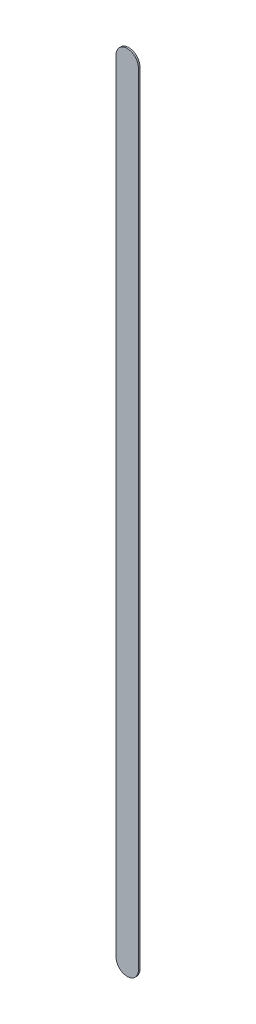
ISO-10303-21;
HEADER;
FILE_DESCRIPTION(('STEP AP214'),'2;1');
FILE_NAME('part.step','',(''),(''),'','','');
FILE_SCHEMA(('AUTOMOTIVE_DESIGN { 1 0 10303 214 1 1 1 1 }'));
ENDSEC;
DATA;
#1=APPLICATION_CONTEXT('core data for automotive mechanical design processes');
#2=APPLICATION_PROTOCOL_DEFINITION('international standard','automotive_design',2000,#1);
#3=PRODUCT_CONTEXT('',#1,'mechanical');
#4=PRODUCT('Part','Part','',(#3));
#5=PRODUCT_RELATED_PRODUCT_CATEGORY('part','',(#4));
#6=PRODUCT_DEFINITION_FORMATION('','',#4);
#7=PRODUCT_DEFINITION_CONTEXT('part definition',#1,'design');
#8=PRODUCT_DEFINITION('design','',#6,#7);
#9=PRODUCT_DEFINITION_SHAPE('','',#8);
#10=(LENGTH_UNIT() NAMED_UNIT(*) SI_UNIT(.MILLI.,.METRE.));
#11=(NAMED_UNIT(*) PLANE_ANGLE_UNIT() SI_UNIT($,.RADIAN.));
#12=(NAMED_UNIT(*) SI_UNIT($,.STERADIAN.) SOLID_ANGLE_UNIT());
#13=UNCERTAINTY_MEASURE_WITH_UNIT(LENGTH_MEASURE(1.E-05),#10,'distance_accuracy_value','');
#14=(GEOMETRIC_REPRESENTATION_CONTEXT(3) GLOBAL_UNCERTAINTY_ASSIGNED_CONTEXT((#13)) GLOBAL_UNIT_ASSIGNED_CONTEXT((#10,
#11,#12)) REPRESENTATION_CONTEXT('',''));
#15=CARTESIAN_POINT('',(0.,0.,0.));
#16=DIRECTION('',(0.,0.,1.));
#17=DIRECTION('',(1.,0.,0.));
#18=AXIS2_PLACEMENT_3D('',#15,#16,#17);
#19=CARTESIAN_POINT('',(62.8193435,82.3306456,0.));
#20=DIRECTION('',(-1.,0.,0.));
#21=DIRECTION('',(0.,1.,0.));
#22=AXIS2_PLACEMENT_3D('',#19,#20,#21);
#23=PLANE('',#22);
#24=DIRECTION('',(0.,1.,0.));
#25=VECTOR('',#24,1.);
#26=CARTESIAN_POINT('',(62.8193435,82.3306456,0.03556));
#27=LINE('',#26,#25);
#28=CARTESIAN_POINT('',(62.8193435,82.3306456,0.03556));
#29=VERTEX_POINT('',#28);
#30=CARTESIAN_POINT('',(62.8193435,99.830636,0.03556));
#31=VERTEX_POINT('',#30);
#32=EDGE_CURVE('E11',#29,#31,#27,.T.);
#33=ORIENTED_EDGE('',*,*,#32,.F.);
#34=DIRECTION('',(0.,0.,1.));
#35=VECTOR('',#34,1.);
#36=CARTESIAN_POINT('',(62.8193435,82.3306456,0.));
#37=LINE('',#36,#35);
#38=CARTESIAN_POINT('',(62.8193435,82.3306456,0.));
#39=VERTEX_POINT('',#38);
#40=EDGE_CURVE('E24',#39,#29,#37,.T.);
#41=ORIENTED_EDGE('',*,*,#40,.F.);
#42=DIRECTION('',(0.,1.,0.));
#43=VECTOR('',#42,1.);
#44=CARTESIAN_POINT('',(62.8193435,82.3306456,0.));
#45=LINE('',#44,#43);
#46=CARTESIAN_POINT('',(62.8193435,99.830636,0.));
#47=VERTEX_POINT('',#46);
#48=EDGE_CURVE('E75',#39,#47,#45,.T.);
#49=ORIENTED_EDGE('',*,*,#48,.T.);
#50=DIRECTION('',(0.,0.,1.));
#51=VECTOR('',#50,1.);
#52=CARTESIAN_POINT('',(62.8193435,99.830636,0.));
#53=LINE('',#52,#51);
#54=EDGE_CURVE('E37',#47,#31,#53,.T.);
#55=ORIENTED_EDGE('',*,*,#54,.T.);
#56=EDGE_LOOP('',(#33,#41,#49,#55));
#57=FACE_BOUND('',#56,.T.);
#58=ADVANCED_FACE('F17',(#57),#23,.F.);
#59=CARTESIAN_POINT('',(62.569344,99.830636,0.));
#60=DIRECTION('',(0.,0.,-1.));
#61=DIRECTION('',(1.,0.,0.));
#62=AXIS2_PLACEMENT_3D('',#59,#60,#61);
#63=CYLINDRICAL_SURFACE('',#62,0.249999500000001);
#64=CARTESIAN_POINT('',(62.569344,99.830636,0.03556));
#65=DIRECTION('',(0.,0.,1.));
#66=DIRECTION('',(1.,0.,0.));
#67=AXIS2_PLACEMENT_3D('',#64,#65,#66);
#68=CIRCLE('',#67,0.249999500000001);
#69=CARTESIAN_POINT('',(62.3193445,99.830636,0.03556));
#70=VERTEX_POINT('',#69);
#71=EDGE_CURVE('E83',#31,#70,#68,.T.);
#72=ORIENTED_EDGE('',*,*,#71,.F.);
#73=ORIENTED_EDGE('',*,*,#54,.F.);
#74=CARTESIAN_POINT('',(62.569344,99.830636,0.));
#75=DIRECTION('',(0.,0.,1.));
#76=DIRECTION('',(1.,0.,0.));
#77=AXIS2_PLACEMENT_3D('',#74,#75,#76);
#78=CIRCLE('',#77,0.249999500000001);
#79=CARTESIAN_POINT('',(62.3193445,99.830636,0.));
#80=VERTEX_POINT('',#79);
#81=EDGE_CURVE('E81',#47,#80,#78,.T.);
#82=ORIENTED_EDGE('',*,*,#81,.T.);
#83=DIRECTION('',(0.,0.,1.));
#84=VECTOR('',#83,1.);
#85=CARTESIAN_POINT('',(62.3193445,99.830636,0.));
#86=LINE('',#85,#84);
#87=EDGE_CURVE('E67',#80,#70,#86,.T.);
#88=ORIENTED_EDGE('',*,*,#87,.T.);
#89=EDGE_LOOP('',(#72,#73,#82,#88));
#90=FACE_BOUND('',#89,.T.);
#91=ADVANCED_FACE('F89',(#90),#63,.T.);
#92=CARTESIAN_POINT('',(62.3193445,99.830636,0.));
#93=DIRECTION('',(1.,0.,0.));
#94=DIRECTION('',(0.,-1.,0.));
#95=AXIS2_PLACEMENT_3D('',#92,#93,#94);
#96=PLANE('',#95);
#97=DIRECTION('',(0.,-1.,0.));
#98=VECTOR('',#97,1.);
#99=CARTESIAN_POINT('',(62.3193445,99.830636,0.03556));
#100=LINE('',#99,#98);
#101=CARTESIAN_POINT('',(62.3193445,82.3306456,0.03556));
#102=VERTEX_POINT('',#101);
#103=EDGE_CURVE('E71',#70,#102,#100,.T.);
#104=ORIENTED_EDGE('',*,*,#103,.F.);
#105=ORIENTED_EDGE('',*,*,#87,.F.);
#106=DIRECTION('',(0.,-1.,0.));
#107=VECTOR('',#106,1.);
#108=CARTESIAN_POINT('',(62.3193445,99.830636,0.));
#109=LINE('',#108,#107);
#110=CARTESIAN_POINT('',(62.3193445,82.3306456,0.));
#111=VERTEX_POINT('',#110);
#112=EDGE_CURVE('E63',#80,#111,#109,.T.);
#113=ORIENTED_EDGE('',*,*,#112,.T.);
#114=DIRECTION('',(0.,0.,1.));
#115=VECTOR('',#114,1.);
#116=CARTESIAN_POINT('',(62.3193445,82.3306456,0.));
#117=LINE('',#116,#115);
#118=EDGE_CURVE('E53',#111,#102,#117,.T.);
#119=ORIENTED_EDGE('',*,*,#118,.T.);
#120=EDGE_LOOP('',(#104,#105,#113,#119));
#121=FACE_BOUND('',#120,.T.);
#122=ADVANCED_FACE('F66',(#121),#96,.F.);
#123=CARTESIAN_POINT('',(62.569344,82.3306456,0.));
#124=DIRECTION('',(0.,0.,-1.));
#125=DIRECTION('',(-1.,0.,0.));
#126=AXIS2_PLACEMENT_3D('',#123,#124,#125);
#127=CYLINDRICAL_SURFACE('',#126,0.249999500000001);
#128=CARTESIAN_POINT('',(62.569344,82.3306456,0.03556));
#129=DIRECTION('',(0.,0.,1.));
#130=DIRECTION('',(-1.,0.,0.));
#131=AXIS2_PLACEMENT_3D('',#128,#129,#130);
#132=CIRCLE('',#131,0.249999500000001);
#133=EDGE_CURVE('E59',#102,#29,#132,.T.);
#134=ORIENTED_EDGE('',*,*,#133,.F.);
#135=ORIENTED_EDGE('',*,*,#118,.F.);
#136=CARTESIAN_POINT('',(62.569344,82.3306456,0.));
#137=DIRECTION('',(0.,0.,1.));
#138=DIRECTION('',(-1.,0.,0.));
#139=AXIS2_PLACEMENT_3D('',#136,#137,#138);
#140=CIRCLE('',#139,0.249999500000001);
#141=EDGE_CURVE('E57',#111,#39,#140,.T.);
#142=ORIENTED_EDGE('',*,*,#141,.T.);
#143=ORIENTED_EDGE('',*,*,#40,.T.);
#144=EDGE_LOOP('',(#134,#135,#142,#143));
#145=FACE_BOUND('',#144,.T.);
#146=ADVANCED_FACE('F55',(#145),#127,.T.);
#147=CARTESIAN_POINT('',(62.8193435,82.3306456,0.));
#148=DIRECTION('',(0.,0.,-1.));
#149=DIRECTION('',(-1.,0.,0.));
#150=AXIS2_PLACEMENT_3D('',#147,#148,#149);
#151=PLANE('',#150);
#152=ORIENTED_EDGE('',*,*,#141,.F.);
#153=ORIENTED_EDGE('',*,*,#112,.F.);
#154=ORIENTED_EDGE('',*,*,#81,.F.);
#155=ORIENTED_EDGE('',*,*,#48,.F.);
#156=EDGE_LOOP('',(#152,#153,#154,#155));
#157=FACE_BOUND('',#156,.T.);
#158=ADVANCED_FACE('F74',(#157),#151,.T.);
#159=CARTESIAN_POINT('',(62.8193435,82.3306456,0.03556));
#160=DIRECTION('',(0.,0.,-1.));
#161=DIRECTION('',(-1.,0.,0.));
#162=AXIS2_PLACEMENT_3D('',#159,#160,#161);
#163=PLANE('',#162);
#164=ORIENTED_EDGE('',*,*,#32,.T.);
#165=ORIENTED_EDGE('',*,*,#71,.T.);
#166=ORIENTED_EDGE('',*,*,#103,.T.);
#167=ORIENTED_EDGE('',*,*,#133,.T.);
#168=EDGE_LOOP('',(#164,#165,#166,#167));
#169=FACE_BOUND('',#168,.T.);
#170=ADVANCED_FACE('F91',(#169),#163,.F.);
#171=CLOSED_SHELL('',(#58,#91,#122,#146,#158,#170));
#172=MANIFOLD_SOLID_BREP('B1',#171);
#173=ADVANCED_BREP_SHAPE_REPRESENTATION('',(#18,#172),#14);
#174=SHAPE_DEFINITION_REPRESENTATION(#9,#173);
ENDSEC;
END-ISO-10303-21;
